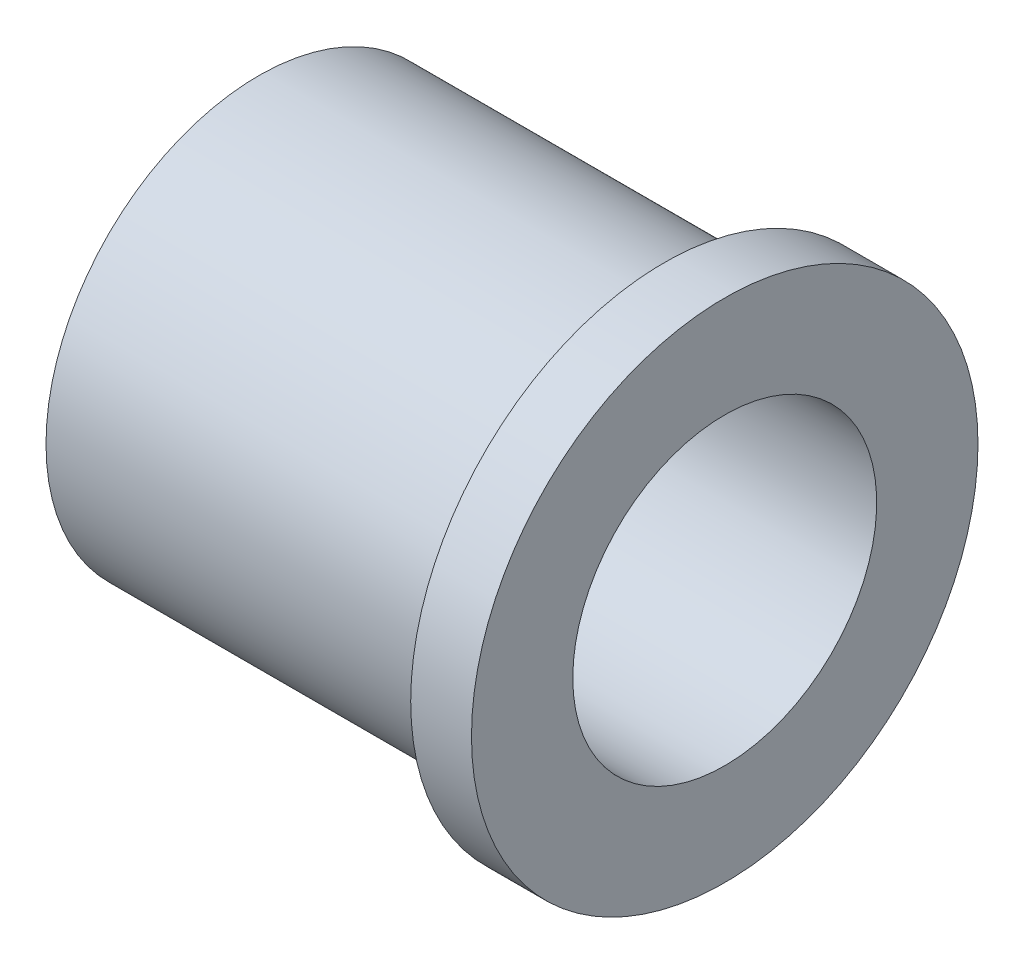
ISO-10303-21;
HEADER;
FILE_DESCRIPTION(('STEP AP214'),'2;1');
FILE_NAME('part.step','',(''),(''),'','','');
FILE_SCHEMA(('AUTOMOTIVE_DESIGN { 1 0 10303 214 1 1 1 1 }'));
ENDSEC;
DATA;
#1=APPLICATION_CONTEXT('core data for automotive mechanical design processes');
#2=APPLICATION_PROTOCOL_DEFINITION('international standard','automotive_design',2000,#1);
#3=PRODUCT_CONTEXT('',#1,'mechanical');
#4=PRODUCT('Part','Part','',(#3));
#5=PRODUCT_RELATED_PRODUCT_CATEGORY('part','',(#4));
#6=PRODUCT_DEFINITION_FORMATION('','',#4);
#7=PRODUCT_DEFINITION_CONTEXT('part definition',#1,'design');
#8=PRODUCT_DEFINITION('design','',#6,#7);
#9=PRODUCT_DEFINITION_SHAPE('','',#8);
#10=(LENGTH_UNIT() NAMED_UNIT(*) SI_UNIT(.MILLI.,.METRE.));
#11=(NAMED_UNIT(*) PLANE_ANGLE_UNIT() SI_UNIT($,.RADIAN.));
#12=(NAMED_UNIT(*) SI_UNIT($,.STERADIAN.) SOLID_ANGLE_UNIT());
#13=UNCERTAINTY_MEASURE_WITH_UNIT(LENGTH_MEASURE(1.E-05),#10,'distance_accuracy_value','');
#14=(GEOMETRIC_REPRESENTATION_CONTEXT(3) GLOBAL_UNCERTAINTY_ASSIGNED_CONTEXT((#13)) GLOBAL_UNIT_ASSIGNED_CONTEXT((#10,
#11,#12)) REPRESENTATION_CONTEXT('',''));
#15=CARTESIAN_POINT('',(0.,0.,0.));
#16=DIRECTION('',(0.,0.,1.));
#17=DIRECTION('',(1.,0.,0.));
#18=AXIS2_PLACEMENT_3D('',#15,#16,#17);
#19=CARTESIAN_POINT('',(0.,0.,0.));
#20=DIRECTION('',(-1.,0.,0.));
#21=DIRECTION('',(0.,0.,1.));
#22=AXIS2_PLACEMENT_3D('',#19,#20,#21);
#23=CYLINDRICAL_SURFACE('',#22,3.75);
#24=CARTESIAN_POINT('',(11.5,0.,0.));
#25=DIRECTION('',(-1.,0.,0.));
#26=DIRECTION('',(0.,0.,1.));
#27=AXIS2_PLACEMENT_3D('',#24,#25,#26);
#28=CIRCLE('',#27,3.75);
#29=CARTESIAN_POINT('',(11.5,0.,3.75));
#30=VERTEX_POINT('',#29);
#31=EDGE_CURVE('E10',#30,#30,#28,.T.);
#32=ORIENTED_EDGE('',*,*,#31,.F.);
#33=EDGE_LOOP('',(#32));
#34=FACE_BOUND('',#33,.T.);
#35=CARTESIAN_POINT('',(0.,0.,0.));
#36=DIRECTION('',(-1.,0.,0.));
#37=DIRECTION('',(0.,0.,1.));
#38=AXIS2_PLACEMENT_3D('',#35,#36,#37);
#39=CIRCLE('',#38,3.75);
#40=CARTESIAN_POINT('',(0.,0.,3.75));
#41=VERTEX_POINT('',#40);
#42=EDGE_CURVE('E55',#41,#41,#39,.T.);
#43=ORIENTED_EDGE('',*,*,#42,.T.);
#44=EDGE_LOOP('',(#43));
#45=FACE_BOUND('',#44,.T.);
#46=ADVANCED_FACE('F33',(#34,#45),#23,.F.);
#47=CARTESIAN_POINT('',(11.5,3.75,0.));
#48=DIRECTION('',(-1.,0.,0.));
#49=DIRECTION('',(0.,0.,1.));
#50=AXIS2_PLACEMENT_3D('',#47,#48,#49);
#51=PLANE('',#50);
#52=CARTESIAN_POINT('',(11.5,0.,0.));
#53=DIRECTION('',(-1.,0.,0.));
#54=DIRECTION('',(0.,0.,1.));
#55=AXIS2_PLACEMENT_3D('',#52,#53,#54);
#56=CIRCLE('',#55,6.25);
#57=CARTESIAN_POINT('',(11.5,0.,6.25));
#58=VERTEX_POINT('',#57);
#59=EDGE_CURVE('E39',#58,#58,#56,.T.);
#60=ORIENTED_EDGE('',*,*,#59,.F.);
#61=EDGE_LOOP('',(#60));
#62=FACE_BOUND('',#61,.T.);
#63=ORIENTED_EDGE('',*,*,#31,.T.);
#64=EDGE_LOOP('',(#63));
#65=FACE_BOUND('',#64,.T.);
#66=ADVANCED_FACE('F80',(#62,#65),#51,.F.);
#67=CARTESIAN_POINT('',(0.,0.,0.));
#68=DIRECTION('',(-1.,0.,0.));
#69=DIRECTION('',(0.,0.,1.));
#70=AXIS2_PLACEMENT_3D('',#67,#68,#69);
#71=CYLINDRICAL_SURFACE('',#70,6.25);
#72=CARTESIAN_POINT('',(10.,0.,0.));
#73=DIRECTION('',(-1.,0.,0.));
#74=DIRECTION('',(0.,0.,1.));
#75=AXIS2_PLACEMENT_3D('',#72,#73,#74);
#76=CIRCLE('',#75,6.25);
#77=CARTESIAN_POINT('',(10.,0.,6.25));
#78=VERTEX_POINT('',#77);
#79=EDGE_CURVE('E43',#78,#78,#76,.T.);
#80=ORIENTED_EDGE('',*,*,#79,.F.);
#81=EDGE_LOOP('',(#80));
#82=FACE_BOUND('',#81,.T.);
#83=ORIENTED_EDGE('',*,*,#59,.T.);
#84=EDGE_LOOP('',(#83));
#85=FACE_BOUND('',#84,.T.);
#86=ADVANCED_FACE('F75',(#82,#85),#71,.T.);
#87=CARTESIAN_POINT('',(10.,6.25,0.));
#88=DIRECTION('',(1.,0.,0.));
#89=DIRECTION('',(0.,0.,-1.));
#90=AXIS2_PLACEMENT_3D('',#87,#88,#89);
#91=PLANE('',#90);
#92=CARTESIAN_POINT('',(10.,0.,0.));
#93=DIRECTION('',(-1.,0.,0.));
#94=DIRECTION('',(0.,0.,1.));
#95=AXIS2_PLACEMENT_3D('',#92,#93,#94);
#96=CIRCLE('',#95,5.25);
#97=CARTESIAN_POINT('',(10.,0.,5.25));
#98=VERTEX_POINT('',#97);
#99=EDGE_CURVE('E47',#98,#98,#96,.T.);
#100=ORIENTED_EDGE('',*,*,#99,.F.);
#101=EDGE_LOOP('',(#100));
#102=FACE_BOUND('',#101,.T.);
#103=ORIENTED_EDGE('',*,*,#79,.T.);
#104=EDGE_LOOP('',(#103));
#105=FACE_BOUND('',#104,.T.);
#106=ADVANCED_FACE('F69',(#102,#105),#91,.F.);
#107=CARTESIAN_POINT('',(0.,0.,0.));
#108=DIRECTION('',(-1.,0.,0.));
#109=DIRECTION('',(0.,0.,1.));
#110=AXIS2_PLACEMENT_3D('',#107,#108,#109);
#111=CYLINDRICAL_SURFACE('',#110,5.25);
#112=CARTESIAN_POINT('',(0.,0.,0.));
#113=DIRECTION('',(-1.,0.,0.));
#114=DIRECTION('',(0.,0.,1.));
#115=AXIS2_PLACEMENT_3D('',#112,#113,#114);
#116=CIRCLE('',#115,5.25);
#117=CARTESIAN_POINT('',(0.,0.,5.25));
#118=VERTEX_POINT('',#117);
#119=EDGE_CURVE('E52',#118,#118,#116,.T.);
#120=ORIENTED_EDGE('',*,*,#119,.F.);
#121=EDGE_LOOP('',(#120));
#122=FACE_BOUND('',#121,.T.);
#123=ORIENTED_EDGE('',*,*,#99,.T.);
#124=EDGE_LOOP('',(#123));
#125=FACE_BOUND('',#124,.T.);
#126=ADVANCED_FACE('F63',(#122,#125),#111,.T.);
#127=CARTESIAN_POINT('',(0.,5.25,0.));
#128=DIRECTION('',(1.,0.,0.));
#129=DIRECTION('',(0.,0.,-1.));
#130=AXIS2_PLACEMENT_3D('',#127,#128,#129);
#131=PLANE('',#130);
#132=ORIENTED_EDGE('',*,*,#42,.F.);
#133=EDGE_LOOP('',(#132));
#134=FACE_BOUND('',#133,.T.);
#135=ORIENTED_EDGE('',*,*,#119,.T.);
#136=EDGE_LOOP('',(#135));
#137=FACE_BOUND('',#136,.T.);
#138=ADVANCED_FACE('F60',(#134,#137),#131,.F.);
#139=CLOSED_SHELL('',(#46,#66,#86,#106,#126,#138));
#140=MANIFOLD_SOLID_BREP('B2',#139);
#141=ADVANCED_BREP_SHAPE_REPRESENTATION('',(#18,#140),#14);
#142=SHAPE_DEFINITION_REPRESENTATION(#9,#141);
ENDSEC;
END-ISO-10303-21;
